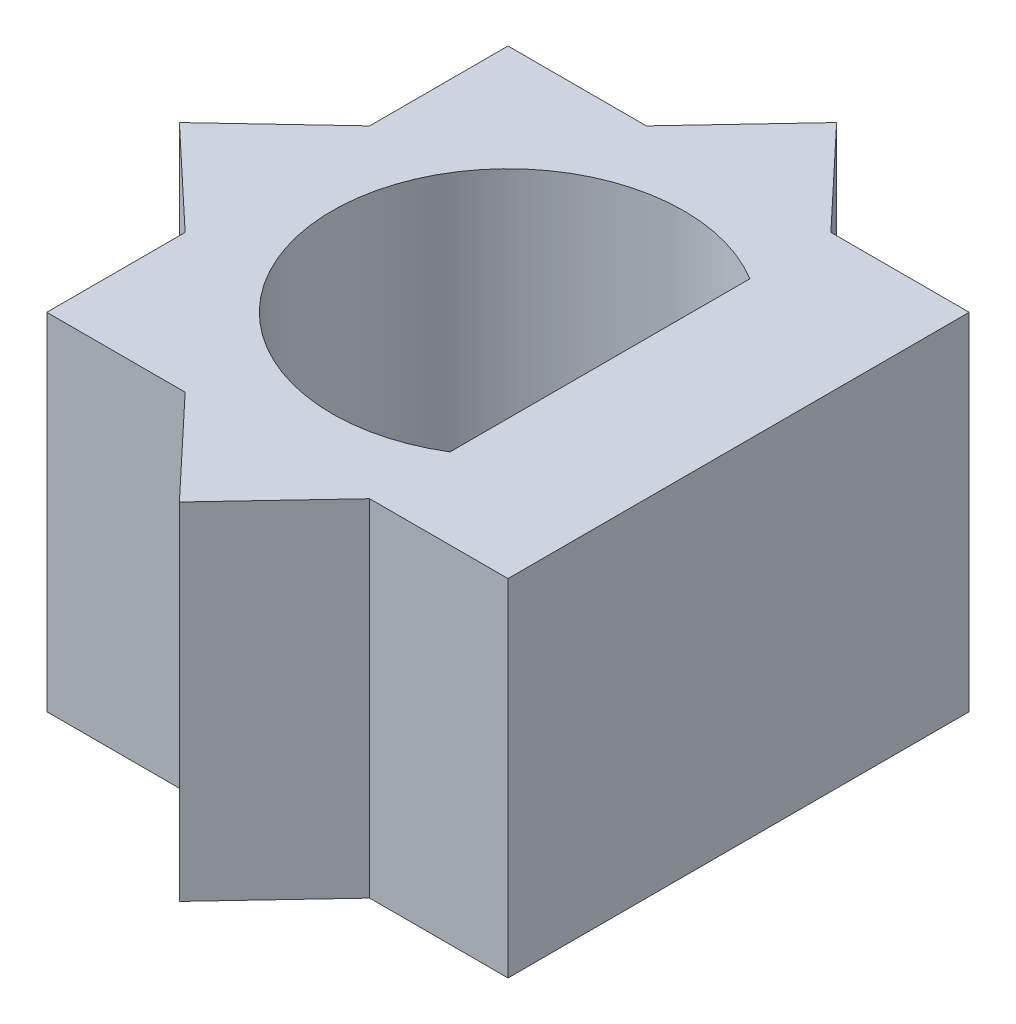
ISO-10303-21;
HEADER;
FILE_DESCRIPTION(('STEP AP214'),'2;1');
FILE_NAME('part.step','',(''),(''),'','','');
FILE_SCHEMA(('AUTOMOTIVE_DESIGN { 1 0 10303 214 1 1 1 1 }'));
ENDSEC;
DATA;
#1=APPLICATION_CONTEXT('core data for automotive mechanical design processes');
#2=APPLICATION_PROTOCOL_DEFINITION('international standard','automotive_design',2000,#1);
#3=PRODUCT_CONTEXT('',#1,'mechanical');
#4=PRODUCT('Part','Part','',(#3));
#5=PRODUCT_RELATED_PRODUCT_CATEGORY('part','',(#4));
#6=PRODUCT_DEFINITION_FORMATION('','',#4);
#7=PRODUCT_DEFINITION_CONTEXT('part definition',#1,'design');
#8=PRODUCT_DEFINITION('design','',#6,#7);
#9=PRODUCT_DEFINITION_SHAPE('','',#8);
#10=(LENGTH_UNIT() NAMED_UNIT(*) SI_UNIT(.MILLI.,.METRE.));
#11=(NAMED_UNIT(*) PLANE_ANGLE_UNIT() SI_UNIT($,.RADIAN.));
#12=(NAMED_UNIT(*) SI_UNIT($,.STERADIAN.) SOLID_ANGLE_UNIT());
#13=UNCERTAINTY_MEASURE_WITH_UNIT(LENGTH_MEASURE(1.E-05),#10,'distance_accuracy_value','');
#14=(GEOMETRIC_REPRESENTATION_CONTEXT(3) GLOBAL_UNCERTAINTY_ASSIGNED_CONTEXT((#13)) GLOBAL_UNIT_ASSIGNED_CONTEXT((#10,
#11,#12)) REPRESENTATION_CONTEXT('',''));
#15=CARTESIAN_POINT('',(0.,0.,0.));
#16=DIRECTION('',(0.,0.,1.));
#17=DIRECTION('',(1.,0.,0.));
#18=AXIS2_PLACEMENT_3D('',#15,#16,#17);
#19=CARTESIAN_POINT('',(-4.,6.,0.));
#20=DIRECTION('',(1.,0.,0.));
#21=DIRECTION('',(0.,0.,-1.));
#22=AXIS2_PLACEMENT_3D('',#19,#20,#21);
#23=PLANE('',#22);
#24=DIRECTION('',(0.,0.,1.));
#25=VECTOR('',#24,1.);
#26=CARTESIAN_POINT('',(-4.,0.,0.));
#27=LINE('',#26,#25);
#28=CARTESIAN_POINT('',(-4.00000000000003,0.,-3.99999999999992));
#29=VERTEX_POINT('',#28);
#30=CARTESIAN_POINT('',(-4.00000000000002,0.,-1.59999999999994));
#31=VERTEX_POINT('',#30);
#32=EDGE_CURVE('E185',#29,#31,#27,.T.);
#33=ORIENTED_EDGE('',*,*,#32,.T.);
#34=DIRECTION('',(0.,-1.,0.));
#35=VECTOR('',#34,1.);
#36=CARTESIAN_POINT('',(-4.00000000000002,6.,-1.59999999999994));
#37=LINE('',#36,#35);
#38=CARTESIAN_POINT('',(-4.00000000000002,6.,-1.59999999999994));
#39=VERTEX_POINT('',#38);
#40=EDGE_CURVE('E11',#39,#31,#37,.T.);
#41=ORIENTED_EDGE('',*,*,#40,.F.);
#42=DIRECTION('',(0.,0.,1.));
#43=VECTOR('',#42,1.);
#44=CARTESIAN_POINT('',(-4.,6.,0.));
#45=LINE('',#44,#43);
#46=CARTESIAN_POINT('',(-4.00000000000003,6.,-3.99999999999992));
#47=VERTEX_POINT('',#46);
#48=EDGE_CURVE('E236',#47,#39,#45,.T.);
#49=ORIENTED_EDGE('',*,*,#48,.F.);
#50=DIRECTION('',(0.,-1.,0.));
#51=VECTOR('',#50,1.);
#52=CARTESIAN_POINT('',(-4.00000000000003,6.,-3.99999999999992));
#53=LINE('',#52,#51);
#54=EDGE_CURVE('E56',#47,#29,#53,.T.);
#55=ORIENTED_EDGE('',*,*,#54,.T.);
#56=EDGE_LOOP('',(#33,#41,#49,#55));
#57=FACE_BOUND('',#56,.T.);
#58=ADVANCED_FACE('F37',(#57),#23,.F.);
#59=CARTESIAN_POINT('',(-2.67743119266046,6.,-2.84477064220183));
#60=DIRECTION('',(-0.685364699004978,0.,-0.728199992692815));
#61=DIRECTION('',(-0.728199992692815,0.,0.685364699004978));
#62=AXIS2_PLACEMENT_3D('',#59,#60,#61);
#63=PLANE('',#62);
#64=DIRECTION('',(0.728199992692815,0.,-0.685364699004978));
#65=VECTOR('',#64,1.);
#66=CARTESIAN_POINT('',(-2.67743119266046,0.,-2.84477064220183));
#67=LINE('',#66,#65);
#68=CARTESIAN_POINT('',(-5.70000000000001,0.,0.));
#69=VERTEX_POINT('',#68);
#70=EDGE_CURVE('E187',#69,#31,#67,.T.);
#71=ORIENTED_EDGE('',*,*,#70,.F.);
#72=DIRECTION('',(0.,-1.,0.));
#73=VECTOR('',#72,1.);
#74=CARTESIAN_POINT('',(-5.70000000000001,6.,0.));
#75=LINE('',#74,#73);
#76=CARTESIAN_POINT('',(-5.70000000000001,6.,0.));
#77=VERTEX_POINT('',#76);
#78=EDGE_CURVE('E47',#77,#69,#75,.T.);
#79=ORIENTED_EDGE('',*,*,#78,.F.);
#80=DIRECTION('',(0.728199992692815,0.,-0.685364699004978));
#81=VECTOR('',#80,1.);
#82=CARTESIAN_POINT('',(-2.67743119266046,6.,-2.84477064220183));
#83=LINE('',#82,#81);
#84=EDGE_CURVE('E239',#77,#39,#83,.T.);
#85=ORIENTED_EDGE('',*,*,#84,.T.);
#86=ORIENTED_EDGE('',*,*,#40,.T.);
#87=EDGE_LOOP('',(#71,#79,#85,#86));
#88=FACE_BOUND('',#87,.T.);
#89=ADVANCED_FACE('F245',(#88),#63,.T.);
#90=CARTESIAN_POINT('',(-2.67743119266062,6.,2.84477064220184));
#91=DIRECTION('',(0.685364699005,0.,-0.728199992692795));
#92=DIRECTION('',(-0.728199992692795,0.,-0.685364699005));
#93=AXIS2_PLACEMENT_3D('',#90,#91,#92);
#94=PLANE('',#93);
#95=DIRECTION('',(0.728199992692795,0.,0.685364699005));
#96=VECTOR('',#95,1.);
#97=CARTESIAN_POINT('',(-2.67743119266062,0.,2.84477064220184));
#98=LINE('',#97,#96);
#99=CARTESIAN_POINT('',(-3.99999999999999,0.,1.60000000000006));
#100=VERTEX_POINT('',#99);
#101=EDGE_CURVE('E191',#69,#100,#98,.T.);
#102=ORIENTED_EDGE('',*,*,#101,.T.);
#103=DIRECTION('',(0.,-1.,0.));
#104=VECTOR('',#103,1.);
#105=CARTESIAN_POINT('',(-3.99999999999999,6.,1.60000000000006));
#106=LINE('',#105,#104);
#107=CARTESIAN_POINT('',(-3.99999999999999,6.,1.60000000000006));
#108=VERTEX_POINT('',#107);
#109=EDGE_CURVE('E229',#108,#100,#106,.T.);
#110=ORIENTED_EDGE('',*,*,#109,.F.);
#111=DIRECTION('',(0.728199992692795,0.,0.685364699005));
#112=VECTOR('',#111,1.);
#113=CARTESIAN_POINT('',(-2.67743119266062,6.,2.84477064220184));
#114=LINE('',#113,#112);
#115=EDGE_CURVE('E247',#77,#108,#114,.T.);
#116=ORIENTED_EDGE('',*,*,#115,.F.);
#117=ORIENTED_EDGE('',*,*,#78,.T.);
#118=EDGE_LOOP('',(#102,#110,#116,#117));
#119=FACE_BOUND('',#118,.T.);
#120=ADVANCED_FACE('F295',(#119),#94,.F.);
#121=CARTESIAN_POINT('',(-3.99999999999997,0.,4.00000000000002));
#122=VERTEX_POINT('',#121);
#123=EDGE_CURVE('E188',#100,#122,#27,.T.);
#124=ORIENTED_EDGE('',*,*,#123,.T.);
#125=DIRECTION('',(0.,-1.,0.));
#126=VECTOR('',#125,1.);
#127=CARTESIAN_POINT('',(-3.99999999999997,6.,4.00000000000002));
#128=LINE('',#127,#126);
#129=CARTESIAN_POINT('',(-3.99999999999997,6.,4.00000000000002));
#130=VERTEX_POINT('',#129);
#131=EDGE_CURVE('E226',#130,#122,#128,.T.);
#132=ORIENTED_EDGE('',*,*,#131,.F.);
#133=EDGE_CURVE('E242',#108,#130,#45,.T.);
#134=ORIENTED_EDGE('',*,*,#133,.F.);
#135=ORIENTED_EDGE('',*,*,#109,.T.);
#136=EDGE_LOOP('',(#124,#132,#134,#135));
#137=FACE_BOUND('',#136,.T.);
#138=ADVANCED_FACE('F291',(#137),#23,.F.);
#139=CARTESIAN_POINT('',(0.,6.,4.00000000000001));
#140=DIRECTION('',(0.,0.,-1.));
#141=DIRECTION('',(-1.,0.,0.));
#142=AXIS2_PLACEMENT_3D('',#139,#140,#141);
#143=PLANE('',#142);
#144=DIRECTION('',(1.,0.,0.));
#145=VECTOR('',#144,1.);
#146=CARTESIAN_POINT('',(0.,0.,4.00000000000001));
#147=LINE('',#146,#145);
#148=CARTESIAN_POINT('',(-1.60000000000008,0.,4.00000000000002));
#149=VERTEX_POINT('',#148);
#150=EDGE_CURVE('E193',#122,#149,#147,.T.);
#151=ORIENTED_EDGE('',*,*,#150,.T.);
#152=DIRECTION('',(0.,-1.,0.));
#153=VECTOR('',#152,1.);
#154=CARTESIAN_POINT('',(-1.60000000000008,6.,4.00000000000002));
#155=LINE('',#154,#153);
#156=CARTESIAN_POINT('',(-1.60000000000008,6.,4.00000000000002));
#157=VERTEX_POINT('',#156);
#158=EDGE_CURVE('E224',#157,#149,#155,.T.);
#159=ORIENTED_EDGE('',*,*,#158,.F.);
#160=DIRECTION('',(1.,0.,0.));
#161=VECTOR('',#160,1.);
#162=CARTESIAN_POINT('',(0.,6.,4.00000000000001));
#163=LINE('',#162,#161);
#164=EDGE_CURVE('E252',#130,#157,#163,.T.);
#165=ORIENTED_EDGE('',*,*,#164,.F.);
#166=ORIENTED_EDGE('',*,*,#131,.T.);
#167=EDGE_LOOP('',(#151,#159,#165,#166));
#168=FACE_BOUND('',#167,.T.);
#169=ADVANCED_FACE('F300',(#168),#143,.F.);
#170=CARTESIAN_POINT('',(-2.84477064220186,6.,2.67743119266066));
#171=DIRECTION('',(-0.728199992692793,0.,0.685364699005002));
#172=DIRECTION('',(0.685364699005002,0.,0.728199992692793));
#173=AXIS2_PLACEMENT_3D('',#170,#171,#172);
#174=PLANE('',#173);
#175=DIRECTION('',(-0.685364699005002,0.,-0.728199992692793));
#176=VECTOR('',#175,1.);
#177=CARTESIAN_POINT('',(-2.84477064220186,0.,2.67743119266066));
#178=LINE('',#177,#176);
#179=CARTESIAN_POINT('',(0.,0.,5.70000000000005));
#180=VERTEX_POINT('',#179);
#181=EDGE_CURVE('E196',#180,#149,#178,.T.);
#182=ORIENTED_EDGE('',*,*,#181,.F.);
#183=DIRECTION('',(0.,-1.,0.));
#184=VECTOR('',#183,1.);
#185=CARTESIAN_POINT('',(0.,6.,5.70000000000005));
#186=LINE('',#185,#184);
#187=CARTESIAN_POINT('',(0.,6.,5.70000000000005));
#188=VERTEX_POINT('',#187);
#189=EDGE_CURVE('E222',#188,#180,#186,.T.);
#190=ORIENTED_EDGE('',*,*,#189,.F.);
#191=DIRECTION('',(-0.685364699005002,0.,-0.728199992692793));
#192=VECTOR('',#191,1.);
#193=CARTESIAN_POINT('',(-2.84477064220186,6.,2.67743119266066));
#194=LINE('',#193,#192);
#195=EDGE_CURVE('E254',#188,#157,#194,.T.);
#196=ORIENTED_EDGE('',*,*,#195,.T.);
#197=ORIENTED_EDGE('',*,*,#158,.T.);
#198=EDGE_LOOP('',(#182,#190,#196,#197));
#199=FACE_BOUND('',#198,.T.);
#200=ADVANCED_FACE('F306',(#199),#174,.T.);
#201=CARTESIAN_POINT('',(2.84477064220184,6.,2.67743119266033));
#202=DIRECTION('',(-0.728199992692832,0.,-0.685364699004959));
#203=DIRECTION('',(-0.685364699004959,0.,0.728199992692833));
#204=AXIS2_PLACEMENT_3D('',#201,#202,#203);
#205=PLANE('',#204);
#206=DIRECTION('',(0.685364699004959,0.,-0.728199992692833));
#207=VECTOR('',#206,1.);
#208=CARTESIAN_POINT('',(2.84477064220184,0.,2.67743119266033));
#209=LINE('',#208,#207);
#210=CARTESIAN_POINT('',(1.59999999999989,0.,4.00000000000001));
#211=VERTEX_POINT('',#210);
#212=EDGE_CURVE('E200',#180,#211,#209,.T.);
#213=ORIENTED_EDGE('',*,*,#212,.T.);
#214=DIRECTION('',(0.,-1.,0.));
#215=VECTOR('',#214,1.);
#216=CARTESIAN_POINT('',(1.59999999999989,6.,4.00000000000001));
#217=LINE('',#216,#215);
#218=CARTESIAN_POINT('',(1.59999999999989,6.,4.00000000000001));
#219=VERTEX_POINT('',#218);
#220=EDGE_CURVE('E219',#219,#211,#217,.T.);
#221=ORIENTED_EDGE('',*,*,#220,.F.);
#222=DIRECTION('',(0.685364699004959,0.,-0.728199992692833));
#223=VECTOR('',#222,1.);
#224=CARTESIAN_POINT('',(2.84477064220184,6.,2.67743119266033));
#225=LINE('',#224,#223);
#226=EDGE_CURVE('E258',#188,#219,#225,.T.);
#227=ORIENTED_EDGE('',*,*,#226,.F.);
#228=ORIENTED_EDGE('',*,*,#189,.T.);
#229=EDGE_LOOP('',(#213,#221,#227,#228));
#230=FACE_BOUND('',#229,.T.);
#231=ADVANCED_FACE('F338',(#230),#205,.F.);
#232=CARTESIAN_POINT('',(3.99999999999987,0.,4.00000000000001));
#233=VERTEX_POINT('',#232);
#234=EDGE_CURVE('E197',#211,#233,#147,.T.);
#235=ORIENTED_EDGE('',*,*,#234,.T.);
#236=DIRECTION('',(0.,-1.,0.));
#237=VECTOR('',#236,1.);
#238=CARTESIAN_POINT('',(3.99999999999987,6.,4.00000000000001));
#239=LINE('',#238,#237);
#240=CARTESIAN_POINT('',(3.99999999999987,6.,4.00000000000001));
#241=VERTEX_POINT('',#240);
#242=EDGE_CURVE('E217',#241,#233,#239,.T.);
#243=ORIENTED_EDGE('',*,*,#242,.F.);
#244=EDGE_CURVE('E255',#219,#241,#163,.T.);
#245=ORIENTED_EDGE('',*,*,#244,.F.);
#246=ORIENTED_EDGE('',*,*,#220,.T.);
#247=EDGE_LOOP('',(#235,#243,#245,#246));
#248=FACE_BOUND('',#247,.T.);
#249=ADVANCED_FACE('F268',(#248),#143,.F.);
#250=CARTESIAN_POINT('',(3.99999999999987,6.,0.));
#251=DIRECTION('',(1.,0.,0.));
#252=DIRECTION('',(0.,0.,-1.));
#253=AXIS2_PLACEMENT_3D('',#250,#251,#252);
#254=PLANE('',#253);
#255=DIRECTION('',(0.,0.,1.));
#256=VECTOR('',#255,1.);
#257=CARTESIAN_POINT('',(3.99999999999987,0.,0.));
#258=LINE('',#257,#256);
#259=CARTESIAN_POINT('',(3.99999999999987,0.,-3.99999999999992));
#260=VERTEX_POINT('',#259);
#261=EDGE_CURVE('E202',#260,#233,#258,.T.);
#262=ORIENTED_EDGE('',*,*,#261,.F.);
#263=DIRECTION('',(0.,-1.,0.));
#264=VECTOR('',#263,1.);
#265=CARTESIAN_POINT('',(3.99999999999987,6.,-3.99999999999992));
#266=LINE('',#265,#264);
#267=CARTESIAN_POINT('',(3.99999999999987,6.,-3.99999999999992));
#268=VERTEX_POINT('',#267);
#269=EDGE_CURVE('E215',#268,#260,#266,.T.);
#270=ORIENTED_EDGE('',*,*,#269,.F.);
#271=DIRECTION('',(0.,0.,1.));
#272=VECTOR('',#271,1.);
#273=CARTESIAN_POINT('',(3.99999999999987,6.,0.));
#274=LINE('',#273,#272);
#275=EDGE_CURVE('E175',#268,#241,#274,.T.);
#276=ORIENTED_EDGE('',*,*,#275,.T.);
#277=ORIENTED_EDGE('',*,*,#242,.T.);
#278=EDGE_LOOP('',(#262,#270,#276,#277));
#279=FACE_BOUND('',#278,.T.);
#280=ADVANCED_FACE('F271',(#279),#254,.T.);
#281=CARTESIAN_POINT('',(0.,6.,-3.99999999999992));
#282=DIRECTION('',(0.,0.,-1.));
#283=DIRECTION('',(-1.,0.,0.));
#284=AXIS2_PLACEMENT_3D('',#281,#282,#283);
#285=PLANE('',#284);
#286=DIRECTION('',(1.,0.,0.));
#287=VECTOR('',#286,1.);
#288=CARTESIAN_POINT('',(0.,0.,-3.99999999999992));
#289=LINE('',#288,#287);
#290=CARTESIAN_POINT('',(1.59999999999987,0.,-3.99999999999992));
#291=VERTEX_POINT('',#290);
#292=EDGE_CURVE('E205',#291,#260,#289,.T.);
#293=ORIENTED_EDGE('',*,*,#292,.F.);
#294=DIRECTION('',(0.,-1.,0.));
#295=VECTOR('',#294,1.);
#296=CARTESIAN_POINT('',(1.59999999999987,6.,-3.99999999999992));
#297=LINE('',#296,#295);
#298=CARTESIAN_POINT('',(1.59999999999987,6.,-3.99999999999992));
#299=VERTEX_POINT('',#298);
#300=EDGE_CURVE('E161',#299,#291,#297,.T.);
#301=ORIENTED_EDGE('',*,*,#300,.F.);
#302=DIRECTION('',(1.,0.,0.));
#303=VECTOR('',#302,1.);
#304=CARTESIAN_POINT('',(0.,6.,-3.99999999999992));
#305=LINE('',#304,#303);
#306=EDGE_CURVE('E173',#299,#268,#305,.T.);
#307=ORIENTED_EDGE('',*,*,#306,.T.);
#308=ORIENTED_EDGE('',*,*,#269,.T.);
#309=EDGE_LOOP('',(#293,#301,#307,#308));
#310=FACE_BOUND('',#309,.T.);
#311=ADVANCED_FACE('F276',(#310),#285,.T.);
#312=CARTESIAN_POINT('',(2.84477064220179,6.,-2.67743119266025));
#313=DIRECTION('',(0.728199992692836,0.,-0.685364699004955));
#314=DIRECTION('',(-0.685364699004956,0.,-0.728199992692836));
#315=AXIS2_PLACEMENT_3D('',#312,#313,#314);
#316=PLANE('',#315);
#317=DIRECTION('',(0.685364699004956,0.,0.728199992692836));
#318=VECTOR('',#317,1.);
#319=CARTESIAN_POINT('',(2.84477064220179,0.,-2.67743119266025));
#320=LINE('',#319,#318);
#321=CARTESIAN_POINT('',(0.,0.,-5.69999999999995));
#322=VERTEX_POINT('',#321);
#323=EDGE_CURVE('E158',#322,#291,#320,.T.);
#324=ORIENTED_EDGE('',*,*,#323,.F.);
#325=DIRECTION('',(0.,-1.,0.));
#326=VECTOR('',#325,1.);
#327=CARTESIAN_POINT('',(0.,6.,-5.69999999999995));
#328=LINE('',#327,#326);
#329=CARTESIAN_POINT('',(0.,6.,-5.69999999999995));
#330=VERTEX_POINT('',#329);
#331=EDGE_CURVE('E152',#330,#322,#328,.T.);
#332=ORIENTED_EDGE('',*,*,#331,.F.);
#333=DIRECTION('',(0.685364699004956,0.,0.728199992692836));
#334=VECTOR('',#333,1.);
#335=CARTESIAN_POINT('',(2.84477064220179,6.,-2.67743119266025));
#336=LINE('',#335,#334);
#337=EDGE_CURVE('E156',#330,#299,#336,.T.);
#338=ORIENTED_EDGE('',*,*,#337,.T.);
#339=ORIENTED_EDGE('',*,*,#300,.T.);
#340=EDGE_LOOP('',(#324,#332,#338,#339));
#341=FACE_BOUND('',#340,.T.);
#342=ADVANCED_FACE('F154',(#341),#316,.T.);
#343=CARTESIAN_POINT('',(-2.84477064220181,6.,-2.67743119266054));
#344=DIRECTION('',(0.728199992692801,0.,0.685364699004992));
#345=DIRECTION('',(0.685364699004992,0.,-0.728199992692802));
#346=AXIS2_PLACEMENT_3D('',#343,#344,#345);
#347=PLANE('',#346);
#348=DIRECTION('',(-0.685364699004992,0.,0.728199992692802));
#349=VECTOR('',#348,1.);
#350=CARTESIAN_POINT('',(-2.84477064220181,0.,-2.67743119266054));
#351=LINE('',#350,#349);
#352=CARTESIAN_POINT('',(-1.60000000000003,0.,-3.99999999999992));
#353=VERTEX_POINT('',#352);
#354=EDGE_CURVE('E210',#322,#353,#351,.T.);
#355=ORIENTED_EDGE('',*,*,#354,.T.);
#356=DIRECTION('',(0.,-1.,0.));
#357=VECTOR('',#356,1.);
#358=CARTESIAN_POINT('',(-1.60000000000003,6.,-3.99999999999992));
#359=LINE('',#358,#357);
#360=CARTESIAN_POINT('',(-1.60000000000003,6.,-3.99999999999992));
#361=VERTEX_POINT('',#360);
#362=EDGE_CURVE('E103',#361,#353,#359,.T.);
#363=ORIENTED_EDGE('',*,*,#362,.F.);
#364=DIRECTION('',(-0.685364699004992,0.,0.728199992692802));
#365=VECTOR('',#364,1.);
#366=CARTESIAN_POINT('',(-2.84477064220181,6.,-2.67743119266054));
#367=LINE('',#366,#365);
#368=EDGE_CURVE('E163',#330,#361,#367,.T.);
#369=ORIENTED_EDGE('',*,*,#368,.F.);
#370=ORIENTED_EDGE('',*,*,#331,.T.);
#371=EDGE_LOOP('',(#355,#363,#369,#370));
#372=FACE_BOUND('',#371,.T.);
#373=ADVANCED_FACE('F164',(#372),#347,.F.);
#374=CARTESIAN_POINT('',(0.,6.,0.));
#375=DIRECTION('',(0.,-1.,0.));
#376=DIRECTION('',(0.,0.,-1.));
#377=AXIS2_PLACEMENT_3D('',#374,#375,#376);
#378=CYLINDRICAL_SURFACE('',#377,3.05);
#379=CARTESIAN_POINT('',(0.,0.,0.));
#380=DIRECTION('',(0.,1.,0.));
#381=DIRECTION('',(0.,0.,1.));
#382=AXIS2_PLACEMENT_3D('',#379,#380,#381);
#383=CIRCLE('',#382,3.05);
#384=CARTESIAN_POINT('',(1.5945218719102,0.,-2.6));
#385=VERTEX_POINT('',#384);
#386=CARTESIAN_POINT('',(1.5945218719102,0.,2.6));
#387=VERTEX_POINT('',#386);
#388=EDGE_CURVE('E179',#385,#387,#383,.T.);
#389=ORIENTED_EDGE('',*,*,#388,.F.);
#390=DIRECTION('',(0.,-1.,0.));
#391=VECTOR('',#390,1.);
#392=CARTESIAN_POINT('',(1.5945218719102,6.,-2.6));
#393=LINE('',#392,#391);
#394=CARTESIAN_POINT('',(1.5945218719102,6.,-2.6));
#395=VERTEX_POINT('',#394);
#396=EDGE_CURVE('E41',#395,#385,#393,.T.);
#397=ORIENTED_EDGE('',*,*,#396,.F.);
#398=CARTESIAN_POINT('',(0.,6.,0.));
#399=DIRECTION('',(0.,1.,0.));
#400=DIRECTION('',(0.,0.,1.));
#401=AXIS2_PLACEMENT_3D('',#398,#399,#400);
#402=CIRCLE('',#401,3.05);
#403=CARTESIAN_POINT('',(1.5945218719102,6.,2.6));
#404=VERTEX_POINT('',#403);
#405=EDGE_CURVE('E322',#395,#404,#402,.T.);
#406=ORIENTED_EDGE('',*,*,#405,.T.);
#407=DIRECTION('',(0.,-1.,0.));
#408=VECTOR('',#407,1.);
#409=CARTESIAN_POINT('',(1.5945218719102,6.,2.6));
#410=LINE('',#409,#408);
#411=EDGE_CURVE('E232',#404,#387,#410,.T.);
#412=ORIENTED_EDGE('',*,*,#411,.T.);
#413=EDGE_LOOP('',(#389,#397,#406,#412));
#414=FACE_BOUND('',#413,.T.);
#415=ADVANCED_FACE('F39',(#414),#378,.F.);
#416=CARTESIAN_POINT('',(1.5945218719102,6.,0.));
#417=DIRECTION('',(1.,0.,0.));
#418=DIRECTION('',(0.,0.,-1.));
#419=AXIS2_PLACEMENT_3D('',#416,#417,#418);
#420=PLANE('',#419);
#421=DIRECTION('',(0.,0.,1.));
#422=VECTOR('',#421,1.);
#423=CARTESIAN_POINT('',(1.5945218719102,0.,0.));
#424=LINE('',#423,#422);
#425=EDGE_CURVE('E182',#385,#387,#424,.T.);
#426=ORIENTED_EDGE('',*,*,#425,.T.);
#427=ORIENTED_EDGE('',*,*,#411,.F.);
#428=DIRECTION('',(0.,0.,1.));
#429=VECTOR('',#428,1.);
#430=CARTESIAN_POINT('',(1.5945218719102,6.,0.));
#431=LINE('',#430,#429);
#432=EDGE_CURVE('E240',#395,#404,#431,.T.);
#433=ORIENTED_EDGE('',*,*,#432,.F.);
#434=ORIENTED_EDGE('',*,*,#396,.T.);
#435=EDGE_LOOP('',(#426,#427,#433,#434));
#436=FACE_BOUND('',#435,.T.);
#437=ADVANCED_FACE('F288',(#436),#420,.F.);
#438=EDGE_CURVE('E208',#29,#353,#289,.T.);
#439=ORIENTED_EDGE('',*,*,#438,.F.);
#440=ORIENTED_EDGE('',*,*,#54,.F.);
#441=EDGE_CURVE('E167',#47,#361,#305,.T.);
#442=ORIENTED_EDGE('',*,*,#441,.T.);
#443=ORIENTED_EDGE('',*,*,#362,.T.);
#444=EDGE_LOOP('',(#439,#440,#442,#443));
#445=FACE_BOUND('',#444,.T.);
#446=ADVANCED_FACE('F234',(#445),#285,.T.);
#447=CARTESIAN_POINT('',(0.,6.,0.));
#448=DIRECTION('',(0.,1.,0.));
#449=DIRECTION('',(0.,0.,1.));
#450=AXIS2_PLACEMENT_3D('',#447,#448,#449);
#451=PLANE('',#450);
#452=ORIENTED_EDGE('',*,*,#405,.F.);
#453=ORIENTED_EDGE('',*,*,#432,.T.);
#454=EDGE_LOOP('',(#452,#453));
#455=FACE_BOUND('',#454,.T.);
#456=ORIENTED_EDGE('',*,*,#48,.T.);
#457=ORIENTED_EDGE('',*,*,#84,.F.);
#458=ORIENTED_EDGE('',*,*,#115,.T.);
#459=ORIENTED_EDGE('',*,*,#133,.T.);
#460=ORIENTED_EDGE('',*,*,#164,.T.);
#461=ORIENTED_EDGE('',*,*,#195,.F.);
#462=ORIENTED_EDGE('',*,*,#226,.T.);
#463=ORIENTED_EDGE('',*,*,#244,.T.);
#464=ORIENTED_EDGE('',*,*,#275,.F.);
#465=ORIENTED_EDGE('',*,*,#306,.F.);
#466=ORIENTED_EDGE('',*,*,#337,.F.);
#467=ORIENTED_EDGE('',*,*,#368,.T.);
#468=ORIENTED_EDGE('',*,*,#441,.F.);
#469=EDGE_LOOP('',(#456,#457,#458,#459,#460,#461,#462,#463,#464,#465,#466,#467,#468));
#470=FACE_BOUND('',#469,.T.);
#471=ADVANCED_FACE('F170',(#455,#470),#451,.T.);
#472=CARTESIAN_POINT('',(0.,0.,0.));
#473=DIRECTION('',(0.,1.,0.));
#474=DIRECTION('',(0.,0.,1.));
#475=AXIS2_PLACEMENT_3D('',#472,#473,#474);
#476=PLANE('',#475);
#477=ORIENTED_EDGE('',*,*,#388,.T.);
#478=ORIENTED_EDGE('',*,*,#425,.F.);
#479=EDGE_LOOP('',(#477,#478));
#480=FACE_BOUND('',#479,.T.);
#481=ORIENTED_EDGE('',*,*,#32,.F.);
#482=ORIENTED_EDGE('',*,*,#438,.T.);
#483=ORIENTED_EDGE('',*,*,#354,.F.);
#484=ORIENTED_EDGE('',*,*,#323,.T.);
#485=ORIENTED_EDGE('',*,*,#292,.T.);
#486=ORIENTED_EDGE('',*,*,#261,.T.);
#487=ORIENTED_EDGE('',*,*,#234,.F.);
#488=ORIENTED_EDGE('',*,*,#212,.F.);
#489=ORIENTED_EDGE('',*,*,#181,.T.);
#490=ORIENTED_EDGE('',*,*,#150,.F.);
#491=ORIENTED_EDGE('',*,*,#123,.F.);
#492=ORIENTED_EDGE('',*,*,#101,.F.);
#493=ORIENTED_EDGE('',*,*,#70,.T.);
#494=EDGE_LOOP('',(#481,#482,#483,#484,#485,#486,#487,#488,#489,#490,#491,#492,#493));
#495=FACE_BOUND('',#494,.T.);
#496=ADVANCED_FACE('F274',(#480,#495),#476,.F.);
#497=CLOSED_SHELL('',(#58,#89,#120,#138,#169,#200,#231,#249,#280,#311,#342,#373,#415,#437,#446,
#471,#496));
#498=MANIFOLD_SOLID_BREP('B2',#497);
#499=ADVANCED_BREP_SHAPE_REPRESENTATION('',(#18,#498),#14);
#500=SHAPE_DEFINITION_REPRESENTATION(#9,#499);
ENDSEC;
END-ISO-10303-21;
